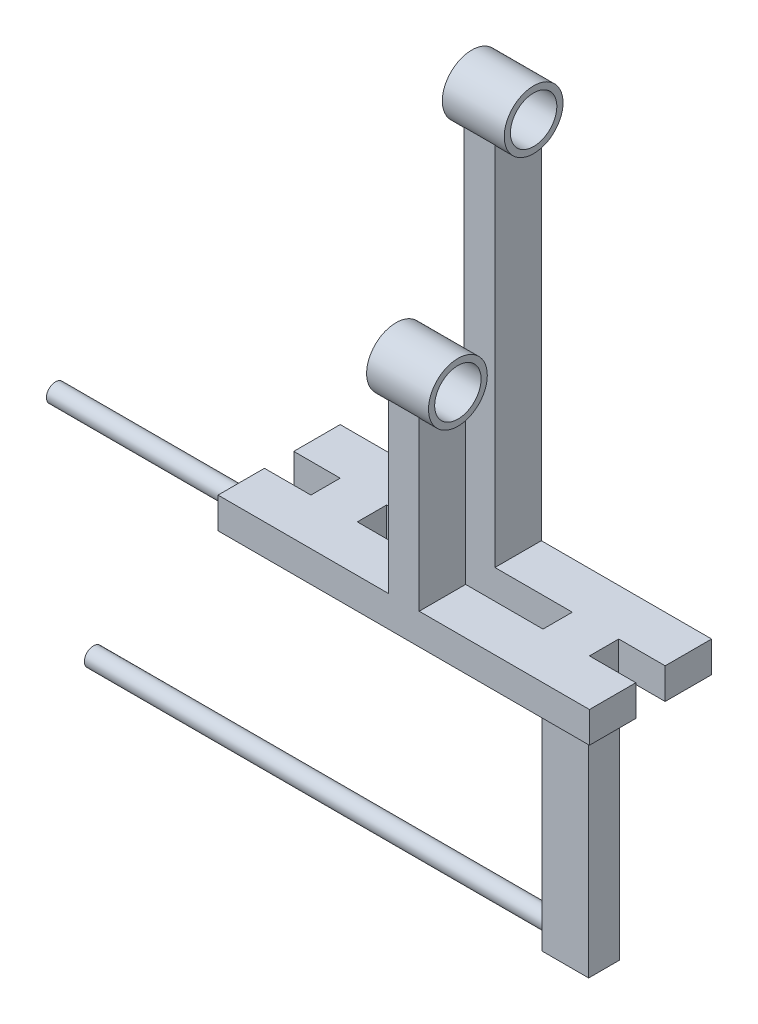
ISO-10303-21;
HEADER;
FILE_DESCRIPTION(('STEP AP214'),'2;1');
FILE_NAME('part.step','',(''),(''),'','','');
FILE_SCHEMA(('AUTOMOTIVE_DESIGN { 1 0 10303 214 1 1 1 1 }'));
ENDSEC;
DATA;
#1=APPLICATION_CONTEXT('core data for automotive mechanical design processes');
#2=APPLICATION_PROTOCOL_DEFINITION('international standard','automotive_design',2000,#1);
#3=PRODUCT_CONTEXT('',#1,'mechanical');
#4=PRODUCT('Part','Part','',(#3));
#5=PRODUCT_RELATED_PRODUCT_CATEGORY('part','',(#4));
#6=PRODUCT_DEFINITION_FORMATION('','',#4);
#7=PRODUCT_DEFINITION_CONTEXT('part definition',#1,'design');
#8=PRODUCT_DEFINITION('design','',#6,#7);
#9=PRODUCT_DEFINITION_SHAPE('','',#8);
#10=(LENGTH_UNIT() NAMED_UNIT(*) SI_UNIT(.MILLI.,.METRE.));
#11=(NAMED_UNIT(*) PLANE_ANGLE_UNIT() SI_UNIT($,.RADIAN.));
#12=(NAMED_UNIT(*) SI_UNIT($,.STERADIAN.) SOLID_ANGLE_UNIT());
#13=UNCERTAINTY_MEASURE_WITH_UNIT(LENGTH_MEASURE(1.E-05),#10,'distance_accuracy_value','');
#14=(GEOMETRIC_REPRESENTATION_CONTEXT(3) GLOBAL_UNCERTAINTY_ASSIGNED_CONTEXT((#13)) GLOBAL_UNIT_ASSIGNED_CONTEXT((#10,
#11,#12)) REPRESENTATION_CONTEXT('',''));
#15=CARTESIAN_POINT('',(0.,0.,0.));
#16=DIRECTION('',(0.,0.,1.));
#17=DIRECTION('',(1.,0.,0.));
#18=AXIS2_PLACEMENT_3D('',#15,#16,#17);
#19=CARTESIAN_POINT('',(-60.,10.,-24.4666089));
#20=DIRECTION('',(0.,0.,1.));
#21=DIRECTION('',(1.,0.,0.));
#22=AXIS2_PLACEMENT_3D('',#19,#20,#21);
#23=PLANE('',#22);
#24=DIRECTION('',(-1.,0.,0.));
#25=VECTOR('',#24,1.);
#26=CARTESIAN_POINT('',(10.,128.219307305155,-24.4666089));
#27=LINE('',#26,#25);
#28=CARTESIAN_POINT('',(5.00000000000001,128.219307305155,-24.4666089));
#29=VERTEX_POINT('',#28);
#30=CARTESIAN_POINT('',(-5.,128.219307305155,-24.4666089));
#31=VERTEX_POINT('',#30);
#32=EDGE_CURVE('E289',#29,#31,#27,.T.);
#33=ORIENTED_EDGE('',*,*,#32,.F.);
#34=DIRECTION('',(0.,-1.,0.));
#35=VECTOR('',#34,1.);
#36=CARTESIAN_POINT('',(5.00000000000001,70.,-24.4666089));
#37=LINE('',#36,#35);
#38=CARTESIAN_POINT('',(5.00000000000001,10.,-24.4666089));
#39=VERTEX_POINT('',#38);
#40=EDGE_CURVE('E336',#29,#39,#37,.T.);
#41=ORIENTED_EDGE('',*,*,#40,.T.);
#42=DIRECTION('',(-1.,0.,0.));
#43=VECTOR('',#42,1.);
#44=CARTESIAN_POINT('',(-60.,10.,-24.4666089));
#45=LINE('',#44,#43);
#46=CARTESIAN_POINT('',(60.,10.,-24.4666089));
#47=VERTEX_POINT('',#46);
#48=EDGE_CURVE('E426',#47,#39,#45,.T.);
#49=ORIENTED_EDGE('',*,*,#48,.F.);
#50=DIRECTION('',(0.,-1.,0.));
#51=VECTOR('',#50,1.);
#52=CARTESIAN_POINT('',(60.,10.,-24.4666089));
#53=LINE('',#52,#51);
#54=CARTESIAN_POINT('',(60.,0.,-24.4666089));
#55=VERTEX_POINT('',#54);
#56=EDGE_CURVE('E511',#47,#55,#53,.T.);
#57=ORIENTED_EDGE('',*,*,#56,.T.);
#58=DIRECTION('',(-1.,0.,0.));
#59=VECTOR('',#58,1.);
#60=CARTESIAN_POINT('',(-60.,0.,-24.4666089));
#61=LINE('',#60,#59);
#62=CARTESIAN_POINT('',(-60.,0.,-24.4666089));
#63=VERTEX_POINT('',#62);
#64=EDGE_CURVE('E464',#55,#63,#61,.T.);
#65=ORIENTED_EDGE('',*,*,#64,.T.);
#66=DIRECTION('',(0.,-1.,0.));
#67=VECTOR('',#66,1.);
#68=CARTESIAN_POINT('',(-60.,10.,-24.4666089));
#69=LINE('',#68,#67);
#70=CARTESIAN_POINT('',(-60.,10.,-24.4666089));
#71=VERTEX_POINT('',#70);
#72=EDGE_CURVE('E507',#71,#63,#69,.T.);
#73=ORIENTED_EDGE('',*,*,#72,.F.);
#74=CARTESIAN_POINT('',(-5.,10.,-24.4666089));
#75=VERTEX_POINT('',#74);
#76=EDGE_CURVE('E425',#75,#71,#45,.T.);
#77=ORIENTED_EDGE('',*,*,#76,.F.);
#78=DIRECTION('',(0.,-1.,0.));
#79=VECTOR('',#78,1.);
#80=CARTESIAN_POINT('',(-5.,70.,-24.4666089));
#81=LINE('',#80,#79);
#82=EDGE_CURVE('E333',#31,#75,#81,.T.);
#83=ORIENTED_EDGE('',*,*,#82,.F.);
#84=EDGE_LOOP('',(#33,#41,#49,#57,#65,#73,#77,#83));
#85=FACE_BOUND('',#84,.T.);
#86=ADVANCED_FACE('F51',(#85),#23,.F.);
#87=CARTESIAN_POINT('',(-30.,10.,-9.46660889999996));
#88=DIRECTION('',(0.,0.,1.));
#89=DIRECTION('',(1.,0.,0.));
#90=AXIS2_PLACEMENT_3D('',#87,#88,#89);
#91=PLANE('',#90);
#92=DIRECTION('',(0.,-1.,0.));
#93=VECTOR('',#92,1.);
#94=CARTESIAN_POINT('',(5.00000000000001,70.,-9.46660889999996));
#95=LINE('',#94,#93);
#96=CARTESIAN_POINT('',(5.00000000000001,128.219307305155,-9.46660889999996));
#97=VERTEX_POINT('',#96);
#98=CARTESIAN_POINT('',(5.00000000000001,10.,-9.46660889999996));
#99=VERTEX_POINT('',#98);
#100=EDGE_CURVE('E339',#97,#99,#95,.T.);
#101=ORIENTED_EDGE('',*,*,#100,.F.);
#102=DIRECTION('',(-1.,0.,0.));
#103=VECTOR('',#102,1.);
#104=CARTESIAN_POINT('',(10.,128.219307305155,-9.46660889999996));
#105=LINE('',#104,#103);
#106=CARTESIAN_POINT('',(-5.,128.219307305155,-9.46660889999996));
#107=VERTEX_POINT('',#106);
#108=EDGE_CURVE('E283',#97,#107,#105,.T.);
#109=ORIENTED_EDGE('',*,*,#108,.T.);
#110=DIRECTION('',(0.,-1.,0.));
#111=VECTOR('',#110,1.);
#112=CARTESIAN_POINT('',(-5.,70.,-9.46660889999996));
#113=LINE('',#112,#111);
#114=CARTESIAN_POINT('',(-5.,10.,-9.46660889999996));
#115=VERTEX_POINT('',#114);
#116=EDGE_CURVE('E342',#107,#115,#113,.T.);
#117=ORIENTED_EDGE('',*,*,#116,.T.);
#118=DIRECTION('',(-1.,0.,0.));
#119=VECTOR('',#118,1.);
#120=CARTESIAN_POINT('',(-30.,10.,-9.46660889999996));
#121=LINE('',#120,#119);
#122=CARTESIAN_POINT('',(-30.,10.,-9.46660889999996));
#123=VERTEX_POINT('',#122);
#124=EDGE_CURVE('E379',#115,#123,#121,.T.);
#125=ORIENTED_EDGE('',*,*,#124,.T.);
#126=DIRECTION('',(0.,-1.,0.));
#127=VECTOR('',#126,1.);
#128=CARTESIAN_POINT('',(-30.,10.,-9.46660889999996));
#129=LINE('',#128,#127);
#130=CARTESIAN_POINT('',(-30.,0.,-9.46660889999996));
#131=VERTEX_POINT('',#130);
#132=EDGE_CURVE('E384',#123,#131,#129,.T.);
#133=ORIENTED_EDGE('',*,*,#132,.T.);
#134=DIRECTION('',(-1.,0.,0.));
#135=VECTOR('',#134,1.);
#136=CARTESIAN_POINT('',(-30.,0.,-9.46660889999996));
#137=LINE('',#136,#135);
#138=CARTESIAN_POINT('',(30.,0.,-9.46660889999996));
#139=VERTEX_POINT('',#138);
#140=EDGE_CURVE('E370',#139,#131,#137,.T.);
#141=ORIENTED_EDGE('',*,*,#140,.F.);
#142=DIRECTION('',(0.,-1.,0.));
#143=VECTOR('',#142,1.);
#144=CARTESIAN_POINT('',(30.,10.,-9.46660889999996));
#145=LINE('',#144,#143);
#146=CARTESIAN_POINT('',(30.,10.,-9.46660889999996));
#147=VERTEX_POINT('',#146);
#148=EDGE_CURVE('E397',#147,#139,#145,.T.);
#149=ORIENTED_EDGE('',*,*,#148,.F.);
#150=EDGE_CURVE('E380',#147,#99,#121,.T.);
#151=ORIENTED_EDGE('',*,*,#150,.T.);
#152=EDGE_LOOP('',(#101,#109,#117,#125,#133,#141,#149,#151));
#153=FACE_BOUND('',#152,.T.);
#154=ADVANCED_FACE('F644',(#153),#91,.T.);
#155=CARTESIAN_POINT('',(60.,10.,15.));
#156=DIRECTION('',(0.,0.,-1.));
#157=DIRECTION('',(-1.,0.,0.));
#158=AXIS2_PLACEMENT_3D('',#155,#156,#157);
#159=PLANE('',#158);
#160=DIRECTION('',(-1.,0.,0.));
#161=VECTOR('',#160,1.);
#162=CARTESIAN_POINT('',(10.,64.1690481051547,15.));
#163=LINE('',#162,#161);
#164=CARTESIAN_POINT('',(-5.,64.1690481051547,15.));
#165=VERTEX_POINT('',#164);
#166=CARTESIAN_POINT('',(5.,64.1690481051547,15.));
#167=VERTEX_POINT('',#166);
#168=EDGE_CURVE('E317',#165,#167,#163,.F.);
#169=ORIENTED_EDGE('',*,*,#168,.F.);
#170=DIRECTION('',(0.,-1.,0.));
#171=VECTOR('',#170,1.);
#172=CARTESIAN_POINT('',(-5.,70.,15.));
#173=LINE('',#172,#171);
#174=CARTESIAN_POINT('',(-5.,10.,15.));
#175=VERTEX_POINT('',#174);
#176=EDGE_CURVE('E362',#165,#175,#173,.T.);
#177=ORIENTED_EDGE('',*,*,#176,.T.);
#178=DIRECTION('',(1.,0.,0.));
#179=VECTOR('',#178,1.);
#180=CARTESIAN_POINT('',(60.,10.,15.));
#181=LINE('',#180,#179);
#182=CARTESIAN_POINT('',(-60.,10.,15.));
#183=VERTEX_POINT('',#182);
#184=EDGE_CURVE('E446',#183,#175,#181,.T.);
#185=ORIENTED_EDGE('',*,*,#184,.F.);
#186=DIRECTION('',(0.,-1.,0.));
#187=VECTOR('',#186,1.);
#188=CARTESIAN_POINT('',(-60.,10.,15.));
#189=LINE('',#188,#187);
#190=CARTESIAN_POINT('',(-60.,0.,15.));
#191=VERTEX_POINT('',#190);
#192=EDGE_CURVE('E487',#183,#191,#189,.T.);
#193=ORIENTED_EDGE('',*,*,#192,.T.);
#194=DIRECTION('',(1.,0.,0.));
#195=VECTOR('',#194,1.);
#196=CARTESIAN_POINT('',(60.,0.,15.));
#197=LINE('',#196,#195);
#198=CARTESIAN_POINT('',(60.,0.,15.));
#199=VERTEX_POINT('',#198);
#200=EDGE_CURVE('E413',#191,#199,#197,.T.);
#201=ORIENTED_EDGE('',*,*,#200,.T.);
#202=DIRECTION('',(0.,-1.,0.));
#203=VECTOR('',#202,1.);
#204=CARTESIAN_POINT('',(60.,10.,15.));
#205=LINE('',#204,#203);
#206=CARTESIAN_POINT('',(60.,10.,15.));
#207=VERTEX_POINT('',#206);
#208=EDGE_CURVE('E450',#207,#199,#205,.T.);
#209=ORIENTED_EDGE('',*,*,#208,.F.);
#210=CARTESIAN_POINT('',(5.,10.,15.));
#211=VERTEX_POINT('',#210);
#212=EDGE_CURVE('E445',#211,#207,#181,.T.);
#213=ORIENTED_EDGE('',*,*,#212,.F.);
#214=DIRECTION('',(0.,-1.,0.));
#215=VECTOR('',#214,1.);
#216=CARTESIAN_POINT('',(5.,70.,15.));
#217=LINE('',#216,#215);
#218=EDGE_CURVE('E359',#167,#211,#217,.T.);
#219=ORIENTED_EDGE('',*,*,#218,.F.);
#220=EDGE_LOOP('',(#169,#177,#185,#193,#201,#209,#213,#219));
#221=FACE_BOUND('',#220,.T.);
#222=ADVANCED_FACE('F606',(#221),#159,.F.);
#223=CARTESIAN_POINT('',(-30.,10.,0.));
#224=DIRECTION('',(0.,0.,-1.));
#225=DIRECTION('',(-1.,0.,0.));
#226=AXIS2_PLACEMENT_3D('',#223,#224,#225);
#227=PLANE('',#226);
#228=DIRECTION('',(0.,-1.,0.));
#229=VECTOR('',#228,1.);
#230=CARTESIAN_POINT('',(-5.,70.,0.));
#231=LINE('',#230,#229);
#232=CARTESIAN_POINT('',(-5.,64.1690481051547,0.));
#233=VERTEX_POINT('',#232);
#234=CARTESIAN_POINT('',(-5.,10.,0.));
#235=VERTEX_POINT('',#234);
#236=EDGE_CURVE('E353',#233,#235,#231,.T.);
#237=ORIENTED_EDGE('',*,*,#236,.F.);
#238=DIRECTION('',(-1.,0.,0.));
#239=VECTOR('',#238,1.);
#240=CARTESIAN_POINT('',(10.,64.1690481051547,0.));
#241=LINE('',#240,#239);
#242=CARTESIAN_POINT('',(5.00000000000001,64.1690481051547,0.));
#243=VERTEX_POINT('',#242);
#244=EDGE_CURVE('E310',#233,#243,#241,.F.);
#245=ORIENTED_EDGE('',*,*,#244,.T.);
#246=DIRECTION('',(0.,-1.,0.));
#247=VECTOR('',#246,1.);
#248=CARTESIAN_POINT('',(5.00000000000001,70.,0.));
#249=LINE('',#248,#247);
#250=CARTESIAN_POINT('',(5.00000000000001,10.,0.));
#251=VERTEX_POINT('',#250);
#252=EDGE_CURVE('E356',#243,#251,#249,.T.);
#253=ORIENTED_EDGE('',*,*,#252,.T.);
#254=DIRECTION('',(1.,0.,0.));
#255=VECTOR('',#254,1.);
#256=CARTESIAN_POINT('',(-30.,10.,0.));
#257=LINE('',#256,#255);
#258=CARTESIAN_POINT('',(30.,10.,0.));
#259=VERTEX_POINT('',#258);
#260=EDGE_CURVE('E369',#251,#259,#257,.T.);
#261=ORIENTED_EDGE('',*,*,#260,.T.);
#262=DIRECTION('',(0.,-1.,0.));
#263=VECTOR('',#262,1.);
#264=CARTESIAN_POINT('',(30.,10.,0.));
#265=LINE('',#264,#263);
#266=CARTESIAN_POINT('',(30.,0.,0.));
#267=VERTEX_POINT('',#266);
#268=EDGE_CURVE('E400',#259,#267,#265,.T.);
#269=ORIENTED_EDGE('',*,*,#268,.T.);
#270=DIRECTION('',(1.,0.,0.));
#271=VECTOR('',#270,1.);
#272=CARTESIAN_POINT('',(-30.,0.,0.));
#273=LINE('',#272,#271);
#274=CARTESIAN_POINT('',(-30.,0.,0.));
#275=VERTEX_POINT('',#274);
#276=EDGE_CURVE('E388',#275,#267,#273,.T.);
#277=ORIENTED_EDGE('',*,*,#276,.F.);
#278=DIRECTION('',(0.,-1.,0.));
#279=VECTOR('',#278,1.);
#280=CARTESIAN_POINT('',(-30.,10.,0.));
#281=LINE('',#280,#279);
#282=CARTESIAN_POINT('',(-30.,10.,0.));
#283=VERTEX_POINT('',#282);
#284=EDGE_CURVE('E403',#283,#275,#281,.T.);
#285=ORIENTED_EDGE('',*,*,#284,.F.);
#286=EDGE_CURVE('E371',#283,#235,#257,.T.);
#287=ORIENTED_EDGE('',*,*,#286,.T.);
#288=EDGE_LOOP('',(#237,#245,#253,#261,#269,#277,#285,#287));
#289=FACE_BOUND('',#288,.T.);
#290=ADVANCED_FACE('F660',(#289),#227,.T.);
#291=CARTESIAN_POINT('',(0.,10.,0.));
#292=DIRECTION('',(0.,-1.,0.));
#293=DIRECTION('',(0.,0.,-1.));
#294=AXIS2_PLACEMENT_3D('',#291,#292,#293);
#295=PLANE('',#294);
#296=DIRECTION('',(0.,0.,1.));
#297=VECTOR('',#296,1.);
#298=CARTESIAN_POINT('',(-5.,10.,-24.4666089));
#299=LINE('',#298,#297);
#300=EDGE_CURVE('E325',#75,#115,#299,.T.);
#301=ORIENTED_EDGE('',*,*,#300,.F.);
#302=ORIENTED_EDGE('',*,*,#76,.T.);
#303=DIRECTION('',(0.,0.,1.));
#304=VECTOR('',#303,1.);
#305=CARTESIAN_POINT('',(-60.,10.,-9.46660889999996));
#306=LINE('',#305,#304);
#307=CARTESIAN_POINT('',(-60.,10.,-9.46660889999996));
#308=VERTEX_POINT('',#307);
#309=EDGE_CURVE('E430',#71,#308,#306,.T.);
#310=ORIENTED_EDGE('',*,*,#309,.T.);
#311=DIRECTION('',(1.,0.,0.));
#312=VECTOR('',#311,1.);
#313=CARTESIAN_POINT('',(-45.,10.,-9.46660889999996));
#314=LINE('',#313,#312);
#315=CARTESIAN_POINT('',(-45.,10.,-9.46660889999996));
#316=VERTEX_POINT('',#315);
#317=EDGE_CURVE('E433',#308,#316,#314,.T.);
#318=ORIENTED_EDGE('',*,*,#317,.T.);
#319=DIRECTION('',(0.,0.,1.));
#320=VECTOR('',#319,1.);
#321=CARTESIAN_POINT('',(-45.,10.,0.));
#322=LINE('',#321,#320);
#323=CARTESIAN_POINT('',(-45.,10.,0.));
#324=VERTEX_POINT('',#323);
#325=EDGE_CURVE('E436',#316,#324,#322,.T.);
#326=ORIENTED_EDGE('',*,*,#325,.T.);
#327=DIRECTION('',(-1.,0.,0.));
#328=VECTOR('',#327,1.);
#329=CARTESIAN_POINT('',(-60.,10.,0.));
#330=LINE('',#329,#328);
#331=CARTESIAN_POINT('',(-60.,10.,0.));
#332=VERTEX_POINT('',#331);
#333=EDGE_CURVE('E439',#324,#332,#330,.T.);
#334=ORIENTED_EDGE('',*,*,#333,.T.);
#335=DIRECTION('',(0.,0.,1.));
#336=VECTOR('',#335,1.);
#337=CARTESIAN_POINT('',(-60.,10.,15.));
#338=LINE('',#337,#336);
#339=EDGE_CURVE('E442',#332,#183,#338,.T.);
#340=ORIENTED_EDGE('',*,*,#339,.T.);
#341=ORIENTED_EDGE('',*,*,#184,.T.);
#342=DIRECTION('',(0.,0.,1.));
#343=VECTOR('',#342,1.);
#344=CARTESIAN_POINT('',(-5.,10.,0.));
#345=LINE('',#344,#343);
#346=EDGE_CURVE('E345',#235,#175,#345,.T.);
#347=ORIENTED_EDGE('',*,*,#346,.F.);
#348=ORIENTED_EDGE('',*,*,#286,.F.);
#349=DIRECTION('',(0.,0.,1.));
#350=VECTOR('',#349,1.);
#351=CARTESIAN_POINT('',(-30.,10.,0.));
#352=LINE('',#351,#350);
#353=EDGE_CURVE('E366',#123,#283,#352,.T.);
#354=ORIENTED_EDGE('',*,*,#353,.F.);
#355=ORIENTED_EDGE('',*,*,#124,.F.);
#356=EDGE_LOOP('',(#301,#302,#310,#318,#326,#334,#340,#341,#347,#348,#354,#355));
#357=FACE_BOUND('',#356,.T.);
#358=ADVANCED_FACE('F666',(#357),#295,.F.);
#359=DIRECTION('',(0.,0.,-1.));
#360=VECTOR('',#359,1.);
#361=CARTESIAN_POINT('',(5.00000000000001,10.,-24.4666089));
#362=LINE('',#361,#360);
#363=EDGE_CURVE('E329',#99,#39,#362,.T.);
#364=ORIENTED_EDGE('',*,*,#363,.F.);
#365=ORIENTED_EDGE('',*,*,#150,.F.);
#366=DIRECTION('',(0.,0.,-1.));
#367=VECTOR('',#366,1.);
#368=CARTESIAN_POINT('',(30.,10.,0.));
#369=LINE('',#368,#367);
#370=EDGE_CURVE('E375',#259,#147,#369,.T.);
#371=ORIENTED_EDGE('',*,*,#370,.F.);
#372=ORIENTED_EDGE('',*,*,#260,.F.);
#373=DIRECTION('',(0.,0.,-1.));
#374=VECTOR('',#373,1.);
#375=CARTESIAN_POINT('',(5.00000000000001,10.,0.));
#376=LINE('',#375,#374);
#377=EDGE_CURVE('E349',#211,#251,#376,.T.);
#378=ORIENTED_EDGE('',*,*,#377,.F.);
#379=ORIENTED_EDGE('',*,*,#212,.T.);
#380=DIRECTION('',(0.,0.,-1.));
#381=VECTOR('',#380,1.);
#382=CARTESIAN_POINT('',(60.,10.,0.));
#383=LINE('',#382,#381);
#384=CARTESIAN_POINT('',(60.,10.,0.));
#385=VERTEX_POINT('',#384);
#386=EDGE_CURVE('E408',#207,#385,#383,.T.);
#387=ORIENTED_EDGE('',*,*,#386,.T.);
#388=DIRECTION('',(-1.,0.,0.));
#389=VECTOR('',#388,1.);
#390=CARTESIAN_POINT('',(45.,10.,0.));
#391=LINE('',#390,#389);
#392=CARTESIAN_POINT('',(45.,10.,0.));
#393=VERTEX_POINT('',#392);
#394=EDGE_CURVE('E412',#385,#393,#391,.T.);
#395=ORIENTED_EDGE('',*,*,#394,.T.);
#396=DIRECTION('',(0.,0.,-1.));
#397=VECTOR('',#396,1.);
#398=CARTESIAN_POINT('',(45.,10.,-9.46660889999997));
#399=LINE('',#398,#397);
#400=CARTESIAN_POINT('',(45.,10.,-9.46660889999997));
#401=VERTEX_POINT('',#400);
#402=EDGE_CURVE('E416',#393,#401,#399,.T.);
#403=ORIENTED_EDGE('',*,*,#402,.T.);
#404=DIRECTION('',(1.,0.,0.));
#405=VECTOR('',#404,1.);
#406=CARTESIAN_POINT('',(60.,10.,-9.46660889999997));
#407=LINE('',#406,#405);
#408=CARTESIAN_POINT('',(60.,10.,-9.46660889999997));
#409=VERTEX_POINT('',#408);
#410=EDGE_CURVE('E419',#401,#409,#407,.T.);
#411=ORIENTED_EDGE('',*,*,#410,.T.);
#412=DIRECTION('',(0.,0.,-1.));
#413=VECTOR('',#412,1.);
#414=CARTESIAN_POINT('',(60.,10.,-24.4666089));
#415=LINE('',#414,#413);
#416=EDGE_CURVE('E422',#409,#47,#415,.T.);
#417=ORIENTED_EDGE('',*,*,#416,.T.);
#418=ORIENTED_EDGE('',*,*,#48,.T.);
#419=EDGE_LOOP('',(#364,#365,#371,#372,#378,#379,#387,#395,#403,#411,#417,#418));
#420=FACE_BOUND('',#419,.T.);
#421=ADVANCED_FACE('F592',(#420),#295,.F.);
#422=CARTESIAN_POINT('',(0.,0.,0.));
#423=DIRECTION('',(0.,-1.,0.));
#424=DIRECTION('',(0.,0.,-1.));
#425=AXIS2_PLACEMENT_3D('',#422,#423,#424);
#426=PLANE('',#425);
#427=DIRECTION('',(0.,0.,-1.));
#428=VECTOR('',#427,1.);
#429=CARTESIAN_POINT('',(30.,0.,-9.74999999999998));
#430=LINE('',#429,#428);
#431=CARTESIAN_POINT('',(30.,0.,0.250000000000016));
#432=VERTEX_POINT('',#431);
#433=EDGE_CURVE('E67',#432,#267,#430,.T.);
#434=ORIENTED_EDGE('',*,*,#433,.F.);
#435=DIRECTION('',(-1.,0.,0.));
#436=VECTOR('',#435,1.);
#437=CARTESIAN_POINT('',(30.,0.,0.250000000000016));
#438=LINE('',#437,#436);
#439=CARTESIAN_POINT('',(45.,0.,0.250000000000016));
#440=VERTEX_POINT('',#439);
#441=EDGE_CURVE('E71',#440,#432,#438,.T.);
#442=ORIENTED_EDGE('',*,*,#441,.F.);
#443=DIRECTION('',(0.,0.,1.));
#444=VECTOR('',#443,1.);
#445=CARTESIAN_POINT('',(45.,0.,-9.74999999999998));
#446=LINE('',#445,#444);
#447=CARTESIAN_POINT('',(45.,0.,0.));
#448=VERTEX_POINT('',#447);
#449=EDGE_CURVE('E60',#448,#440,#446,.T.);
#450=ORIENTED_EDGE('',*,*,#449,.F.);
#451=DIRECTION('',(-1.,0.,0.));
#452=VECTOR('',#451,1.);
#453=CARTESIAN_POINT('',(45.,0.,0.));
#454=LINE('',#453,#452);
#455=CARTESIAN_POINT('',(60.,0.,0.));
#456=VERTEX_POINT('',#455);
#457=EDGE_CURVE('E454',#456,#448,#454,.T.);
#458=ORIENTED_EDGE('',*,*,#457,.F.);
#459=DIRECTION('',(0.,0.,-1.));
#460=VECTOR('',#459,1.);
#461=CARTESIAN_POINT('',(60.,0.,0.));
#462=LINE('',#461,#460);
#463=EDGE_CURVE('E407',#199,#456,#462,.T.);
#464=ORIENTED_EDGE('',*,*,#463,.F.);
#465=ORIENTED_EDGE('',*,*,#200,.F.);
#466=DIRECTION('',(0.,0.,1.));
#467=VECTOR('',#466,1.);
#468=CARTESIAN_POINT('',(-60.,0.,15.));
#469=LINE('',#468,#467);
#470=CARTESIAN_POINT('',(-60.,0.,0.));
#471=VERTEX_POINT('',#470);
#472=EDGE_CURVE('E479',#471,#191,#469,.T.);
#473=ORIENTED_EDGE('',*,*,#472,.F.);
#474=DIRECTION('',(-1.,0.,0.));
#475=VECTOR('',#474,1.);
#476=CARTESIAN_POINT('',(-60.,0.,0.));
#477=LINE('',#476,#475);
#478=CARTESIAN_POINT('',(-45.,0.,0.));
#479=VERTEX_POINT('',#478);
#480=EDGE_CURVE('E476',#479,#471,#477,.T.);
#481=ORIENTED_EDGE('',*,*,#480,.F.);
#482=DIRECTION('',(0.,0.,1.));
#483=VECTOR('',#482,1.);
#484=CARTESIAN_POINT('',(-45.,0.,0.));
#485=LINE('',#484,#483);
#486=CARTESIAN_POINT('',(-45.,0.,-9.46660889999996));
#487=VERTEX_POINT('',#486);
#488=EDGE_CURVE('E473',#487,#479,#485,.T.);
#489=ORIENTED_EDGE('',*,*,#488,.F.);
#490=DIRECTION('',(1.,0.,0.));
#491=VECTOR('',#490,1.);
#492=CARTESIAN_POINT('',(-45.,0.,-9.46660889999996));
#493=LINE('',#492,#491);
#494=CARTESIAN_POINT('',(-60.,0.,-9.46660889999996));
#495=VERTEX_POINT('',#494);
#496=EDGE_CURVE('E470',#495,#487,#493,.T.);
#497=ORIENTED_EDGE('',*,*,#496,.F.);
#498=DIRECTION('',(0.,0.,1.));
#499=VECTOR('',#498,1.);
#500=CARTESIAN_POINT('',(-60.,0.,-9.46660889999996));
#501=LINE('',#500,#499);
#502=EDGE_CURVE('E467',#63,#495,#501,.T.);
#503=ORIENTED_EDGE('',*,*,#502,.F.);
#504=ORIENTED_EDGE('',*,*,#64,.F.);
#505=DIRECTION('',(0.,0.,-1.));
#506=VECTOR('',#505,1.);
#507=CARTESIAN_POINT('',(60.,0.,-24.4666089));
#508=LINE('',#507,#506);
#509=CARTESIAN_POINT('',(60.,0.,-9.46660889999997));
#510=VERTEX_POINT('',#509);
#511=EDGE_CURVE('E461',#510,#55,#508,.T.);
#512=ORIENTED_EDGE('',*,*,#511,.F.);
#513=DIRECTION('',(1.,0.,0.));
#514=VECTOR('',#513,1.);
#515=CARTESIAN_POINT('',(60.,0.,-9.46660889999997));
#516=LINE('',#515,#514);
#517=CARTESIAN_POINT('',(45.,0.,-9.46660889999997));
#518=VERTEX_POINT('',#517);
#519=EDGE_CURVE('E458',#518,#510,#516,.T.);
#520=ORIENTED_EDGE('',*,*,#519,.F.);
#521=CARTESIAN_POINT('',(45.,0.,-9.74999999999998));
#522=VERTEX_POINT('',#521);
#523=EDGE_CURVE('E542',#522,#518,#446,.T.);
#524=ORIENTED_EDGE('',*,*,#523,.F.);
#525=DIRECTION('',(1.,0.,0.));
#526=VECTOR('',#525,1.);
#527=CARTESIAN_POINT('',(30.,0.,-9.74999999999998));
#528=LINE('',#527,#526);
#529=CARTESIAN_POINT('',(30.,0.,-9.74999999999998));
#530=VERTEX_POINT('',#529);
#531=EDGE_CURVE('E546',#530,#522,#528,.T.);
#532=ORIENTED_EDGE('',*,*,#531,.F.);
#533=EDGE_CURVE('E262',#139,#530,#430,.T.);
#534=ORIENTED_EDGE('',*,*,#533,.F.);
#535=ORIENTED_EDGE('',*,*,#140,.T.);
#536=DIRECTION('',(0.,0.,1.));
#537=VECTOR('',#536,1.);
#538=CARTESIAN_POINT('',(-30.,0.,0.));
#539=LINE('',#538,#537);
#540=EDGE_CURVE('E365',#131,#275,#539,.T.);
#541=ORIENTED_EDGE('',*,*,#540,.T.);
#542=ORIENTED_EDGE('',*,*,#276,.T.);
#543=EDGE_LOOP('',(#434,#442,#450,#458,#464,#465,#473,#481,#489,#497,#503,#504,#512,#520,#524,
#532,#534,#535,#541,#542));
#544=FACE_BOUND('',#543,.T.);
#545=ADVANCED_FACE('F579',(#544),#426,.T.);
#546=CARTESIAN_POINT('',(60.,10.,0.));
#547=DIRECTION('',(-1.,0.,0.));
#548=DIRECTION('',(0.,0.,1.));
#549=AXIS2_PLACEMENT_3D('',#546,#547,#548);
#550=PLANE('',#549);
#551=ORIENTED_EDGE('',*,*,#463,.T.);
#552=DIRECTION('',(0.,-1.,0.));
#553=VECTOR('',#552,1.);
#554=CARTESIAN_POINT('',(60.,10.,0.));
#555=LINE('',#554,#553);
#556=EDGE_CURVE('E526',#385,#456,#555,.T.);
#557=ORIENTED_EDGE('',*,*,#556,.F.);
#558=ORIENTED_EDGE('',*,*,#386,.F.);
#559=ORIENTED_EDGE('',*,*,#208,.T.);
#560=EDGE_LOOP('',(#551,#557,#558,#559));
#561=FACE_BOUND('',#560,.T.);
#562=ADVANCED_FACE('F53',(#561),#550,.F.);
#563=CARTESIAN_POINT('',(45.,10.,0.));
#564=DIRECTION('',(0.,0.,1.));
#565=DIRECTION('',(1.,0.,0.));
#566=AXIS2_PLACEMENT_3D('',#563,#564,#565);
#567=PLANE('',#566);
#568=ORIENTED_EDGE('',*,*,#457,.T.);
#569=DIRECTION('',(0.,-1.,0.));
#570=VECTOR('',#569,1.);
#571=CARTESIAN_POINT('',(45.,10.,0.));
#572=LINE('',#571,#570);
#573=EDGE_CURVE('E522',#393,#448,#572,.T.);
#574=ORIENTED_EDGE('',*,*,#573,.F.);
#575=ORIENTED_EDGE('',*,*,#394,.F.);
#576=ORIENTED_EDGE('',*,*,#556,.T.);
#577=EDGE_LOOP('',(#568,#574,#575,#576));
#578=FACE_BOUND('',#577,.T.);
#579=ADVANCED_FACE('F596',(#578),#567,.F.);
#580=CARTESIAN_POINT('',(45.,10.,-9.46660889999997));
#581=DIRECTION('',(-1.,0.,0.));
#582=DIRECTION('',(0.,0.,1.));
#583=AXIS2_PLACEMENT_3D('',#580,#581,#582);
#584=PLANE('',#583);
#585=ORIENTED_EDGE('',*,*,#573,.T.);
#586=ORIENTED_EDGE('',*,*,#449,.T.);
#587=DIRECTION('',(0.,1.,0.));
#588=VECTOR('',#587,1.);
#589=CARTESIAN_POINT('',(45.,-80.,0.250000000000016));
#590=LINE('',#589,#588);
#591=CARTESIAN_POINT('',(45.,-80.,0.250000000000016));
#592=VERTEX_POINT('',#591);
#593=EDGE_CURVE('E271',#592,#440,#590,.T.);
#594=ORIENTED_EDGE('',*,*,#593,.F.);
#595=DIRECTION('',(0.,0.,1.));
#596=VECTOR('',#595,1.);
#597=CARTESIAN_POINT('',(45.,-80.,-9.74999999999998));
#598=LINE('',#597,#596);
#599=CARTESIAN_POINT('',(45.,-80.,-9.74999999999998));
#600=VERTEX_POINT('',#599);
#601=EDGE_CURVE('E247',#600,#592,#598,.T.);
#602=ORIENTED_EDGE('',*,*,#601,.F.);
#603=DIRECTION('',(0.,1.,0.));
#604=VECTOR('',#603,1.);
#605=CARTESIAN_POINT('',(45.,-80.,-9.74999999999998));
#606=LINE('',#605,#604);
#607=EDGE_CURVE('E243',#600,#522,#606,.T.);
#608=ORIENTED_EDGE('',*,*,#607,.T.);
#609=ORIENTED_EDGE('',*,*,#523,.T.);
#610=DIRECTION('',(0.,-1.,0.));
#611=VECTOR('',#610,1.);
#612=CARTESIAN_POINT('',(45.,10.,-9.46660889999997));
#613=LINE('',#612,#611);
#614=EDGE_CURVE('E519',#401,#518,#613,.T.);
#615=ORIENTED_EDGE('',*,*,#614,.F.);
#616=ORIENTED_EDGE('',*,*,#402,.F.);
#617=EDGE_LOOP('',(#585,#586,#594,#602,#608,#609,#615,#616));
#618=FACE_BOUND('',#617,.T.);
#619=ADVANCED_FACE('F575',(#618),#584,.F.);
#620=CARTESIAN_POINT('',(60.,10.,-9.46660889999997));
#621=DIRECTION('',(0.,0.,-1.));
#622=DIRECTION('',(-1.,0.,0.));
#623=AXIS2_PLACEMENT_3D('',#620,#621,#622);
#624=PLANE('',#623);
#625=ORIENTED_EDGE('',*,*,#519,.T.);
#626=DIRECTION('',(0.,-1.,0.));
#627=VECTOR('',#626,1.);
#628=CARTESIAN_POINT('',(60.,10.,-9.46660889999997));
#629=LINE('',#628,#627);
#630=EDGE_CURVE('E515',#409,#510,#629,.T.);
#631=ORIENTED_EDGE('',*,*,#630,.F.);
#632=ORIENTED_EDGE('',*,*,#410,.F.);
#633=ORIENTED_EDGE('',*,*,#614,.T.);
#634=EDGE_LOOP('',(#625,#631,#632,#633));
#635=FACE_BOUND('',#634,.T.);
#636=ADVANCED_FACE('F584',(#635),#624,.F.);
#637=CARTESIAN_POINT('',(60.,10.,-24.4666089));
#638=DIRECTION('',(-1.,0.,0.));
#639=DIRECTION('',(0.,0.,1.));
#640=AXIS2_PLACEMENT_3D('',#637,#638,#639);
#641=PLANE('',#640);
#642=ORIENTED_EDGE('',*,*,#511,.T.);
#643=ORIENTED_EDGE('',*,*,#56,.F.);
#644=ORIENTED_EDGE('',*,*,#416,.F.);
#645=ORIENTED_EDGE('',*,*,#630,.T.);
#646=EDGE_LOOP('',(#642,#643,#644,#645));
#647=FACE_BOUND('',#646,.T.);
#648=ADVANCED_FACE('F587',(#647),#641,.F.);
#649=CARTESIAN_POINT('',(-60.,10.,-9.46660889999996));
#650=DIRECTION('',(1.,0.,0.));
#651=DIRECTION('',(0.,0.,-1.));
#652=AXIS2_PLACEMENT_3D('',#649,#650,#651);
#653=PLANE('',#652);
#654=ORIENTED_EDGE('',*,*,#502,.T.);
#655=DIRECTION('',(0.,-1.,0.));
#656=VECTOR('',#655,1.);
#657=CARTESIAN_POINT('',(-60.,10.,-9.46660889999996));
#658=LINE('',#657,#656);
#659=EDGE_CURVE('E503',#308,#495,#658,.T.);
#660=ORIENTED_EDGE('',*,*,#659,.F.);
#661=ORIENTED_EDGE('',*,*,#309,.F.);
#662=ORIENTED_EDGE('',*,*,#72,.T.);
#663=EDGE_LOOP('',(#654,#660,#661,#662));
#664=FACE_BOUND('',#663,.T.);
#665=ADVANCED_FACE('F631',(#664),#653,.F.);
#666=CARTESIAN_POINT('',(-45.,10.,-9.46660889999996));
#667=DIRECTION('',(0.,0.,-1.));
#668=DIRECTION('',(-1.,0.,0.));
#669=AXIS2_PLACEMENT_3D('',#666,#667,#668);
#670=PLANE('',#669);
#671=ORIENTED_EDGE('',*,*,#496,.T.);
#672=DIRECTION('',(0.,-1.,0.));
#673=VECTOR('',#672,1.);
#674=CARTESIAN_POINT('',(-45.,10.,-9.46660889999996));
#675=LINE('',#674,#673);
#676=EDGE_CURVE('E499',#316,#487,#675,.T.);
#677=ORIENTED_EDGE('',*,*,#676,.F.);
#678=ORIENTED_EDGE('',*,*,#317,.F.);
#679=ORIENTED_EDGE('',*,*,#659,.T.);
#680=EDGE_LOOP('',(#671,#677,#678,#679));
#681=FACE_BOUND('',#680,.T.);
#682=ADVANCED_FACE('F627',(#681),#670,.F.);
#683=CARTESIAN_POINT('',(-45.,10.,0.));
#684=DIRECTION('',(1.,0.,0.));
#685=DIRECTION('',(0.,0.,-1.));
#686=AXIS2_PLACEMENT_3D('',#683,#684,#685);
#687=PLANE('',#686);
#688=ORIENTED_EDGE('',*,*,#488,.T.);
#689=DIRECTION('',(0.,-1.,0.));
#690=VECTOR('',#689,1.);
#691=CARTESIAN_POINT('',(-45.,10.,0.));
#692=LINE('',#691,#690);
#693=EDGE_CURVE('E495',#324,#479,#692,.T.);
#694=ORIENTED_EDGE('',*,*,#693,.F.);
#695=ORIENTED_EDGE('',*,*,#325,.F.);
#696=ORIENTED_EDGE('',*,*,#676,.T.);
#697=EDGE_LOOP('',(#688,#694,#695,#696));
#698=FACE_BOUND('',#697,.T.);
#699=ADVANCED_FACE('F623',(#698),#687,.F.);
#700=CARTESIAN_POINT('',(-60.,10.,0.));
#701=DIRECTION('',(0.,0.,1.));
#702=DIRECTION('',(1.,0.,0.));
#703=AXIS2_PLACEMENT_3D('',#700,#701,#702);
#704=PLANE('',#703);
#705=ORIENTED_EDGE('',*,*,#480,.T.);
#706=DIRECTION('',(0.,-1.,0.));
#707=VECTOR('',#706,1.);
#708=CARTESIAN_POINT('',(-60.,10.,0.));
#709=LINE('',#708,#707);
#710=EDGE_CURVE('E491',#332,#471,#709,.T.);
#711=ORIENTED_EDGE('',*,*,#710,.F.);
#712=ORIENTED_EDGE('',*,*,#333,.F.);
#713=ORIENTED_EDGE('',*,*,#693,.T.);
#714=EDGE_LOOP('',(#705,#711,#712,#713));
#715=FACE_BOUND('',#714,.T.);
#716=ADVANCED_FACE('F618',(#715),#704,.F.);
#717=CARTESIAN_POINT('',(-60.,10.,15.));
#718=DIRECTION('',(1.,0.,0.));
#719=DIRECTION('',(0.,0.,-1.));
#720=AXIS2_PLACEMENT_3D('',#717,#718,#719);
#721=PLANE('',#720);
#722=CARTESIAN_POINT('',(-60.,5.,7.50000000000002));
#723=DIRECTION('',(1.,0.,0.));
#724=DIRECTION('',(0.,0.,-1.));
#725=AXIS2_PLACEMENT_3D('',#722,#723,#724);
#726=CIRCLE('',#725,2.95);
#727=CARTESIAN_POINT('',(-60.,5.,4.55000000000002));
#728=VERTEX_POINT('',#727);
#729=EDGE_CURVE('E12',#728,#728,#726,.F.);
#730=ORIENTED_EDGE('',*,*,#729,.F.);
#731=EDGE_LOOP('',(#730));
#732=FACE_BOUND('',#731,.T.);
#733=ORIENTED_EDGE('',*,*,#472,.T.);
#734=ORIENTED_EDGE('',*,*,#192,.F.);
#735=ORIENTED_EDGE('',*,*,#339,.F.);
#736=ORIENTED_EDGE('',*,*,#710,.T.);
#737=EDGE_LOOP('',(#733,#734,#735,#736));
#738=FACE_BOUND('',#737,.T.);
#739=ADVANCED_FACE('F612',(#732,#738),#721,.F.);
#740=CARTESIAN_POINT('',(-30.,10.,0.));
#741=DIRECTION('',(1.,0.,0.));
#742=DIRECTION('',(0.,0.,-1.));
#743=AXIS2_PLACEMENT_3D('',#740,#741,#742);
#744=PLANE('',#743);
#745=ORIENTED_EDGE('',*,*,#540,.F.);
#746=ORIENTED_EDGE('',*,*,#132,.F.);
#747=ORIENTED_EDGE('',*,*,#353,.T.);
#748=ORIENTED_EDGE('',*,*,#284,.T.);
#749=EDGE_LOOP('',(#745,#746,#747,#748));
#750=FACE_BOUND('',#749,.T.);
#751=ADVANCED_FACE('F673',(#750),#744,.T.);
#752=CARTESIAN_POINT('',(30.,10.,0.));
#753=DIRECTION('',(-1.,0.,0.));
#754=DIRECTION('',(0.,0.,1.));
#755=AXIS2_PLACEMENT_3D('',#752,#753,#754);
#756=PLANE('',#755);
#757=CARTESIAN_POINT('',(30.,-75.,-4.74999999999998));
#758=DIRECTION('',(-1.,0.,0.));
#759=DIRECTION('',(0.,0.,1.));
#760=AXIS2_PLACEMENT_3D('',#757,#758,#759);
#761=CIRCLE('',#760,2.95000000000001);
#762=CARTESIAN_POINT('',(30.,-75.,-1.79999999999997));
#763=VERTEX_POINT('',#762);
#764=EDGE_CURVE('E552',#763,#763,#761,.T.);
#765=ORIENTED_EDGE('',*,*,#764,.F.);
#766=EDGE_LOOP('',(#765));
#767=FACE_BOUND('',#766,.T.);
#768=ORIENTED_EDGE('',*,*,#148,.T.);
#769=ORIENTED_EDGE('',*,*,#533,.T.);
#770=DIRECTION('',(0.,1.,0.));
#771=VECTOR('',#770,1.);
#772=CARTESIAN_POINT('',(30.,-80.,-9.74999999999998));
#773=LINE('',#772,#771);
#774=CARTESIAN_POINT('',(30.,-80.,-9.74999999999998));
#775=VERTEX_POINT('',#774);
#776=EDGE_CURVE('E241',#775,#530,#773,.T.);
#777=ORIENTED_EDGE('',*,*,#776,.F.);
#778=DIRECTION('',(0.,0.,-1.));
#779=VECTOR('',#778,1.);
#780=CARTESIAN_POINT('',(30.,-80.,-9.74999999999998));
#781=LINE('',#780,#779);
#782=CARTESIAN_POINT('',(30.,-80.,0.250000000000016));
#783=VERTEX_POINT('',#782);
#784=EDGE_CURVE('E248',#783,#775,#781,.T.);
#785=ORIENTED_EDGE('',*,*,#784,.F.);
#786=DIRECTION('',(0.,1.,0.));
#787=VECTOR('',#786,1.);
#788=CARTESIAN_POINT('',(30.,-80.,0.250000000000016));
#789=LINE('',#788,#787);
#790=EDGE_CURVE('E564',#783,#432,#789,.T.);
#791=ORIENTED_EDGE('',*,*,#790,.T.);
#792=ORIENTED_EDGE('',*,*,#433,.T.);
#793=ORIENTED_EDGE('',*,*,#268,.F.);
#794=ORIENTED_EDGE('',*,*,#370,.T.);
#795=EDGE_LOOP('',(#768,#769,#777,#785,#791,#792,#793,#794));
#796=FACE_BOUND('',#795,.T.);
#797=ADVANCED_FACE('F261',(#767,#796),#756,.T.);
#798=CARTESIAN_POINT('',(-5.,70.,0.));
#799=DIRECTION('',(1.,0.,0.));
#800=DIRECTION('',(0.,0.,-1.));
#801=AXIS2_PLACEMENT_3D('',#798,#799,#800);
#802=PLANE('',#801);
#803=CARTESIAN_POINT('',(-5.,70.,7.5));
#804=DIRECTION('',(1.,0.,0.));
#805=DIRECTION('',(0.,0.,-1.));
#806=AXIS2_PLACEMENT_3D('',#803,#804,#805);
#807=CIRCLE('',#806,9.50000000000001);
#808=EDGE_CURVE('E321',#233,#165,#807,.F.);
#809=ORIENTED_EDGE('',*,*,#808,.F.);
#810=ORIENTED_EDGE('',*,*,#236,.T.);
#811=ORIENTED_EDGE('',*,*,#346,.T.);
#812=ORIENTED_EDGE('',*,*,#176,.F.);
#813=EDGE_LOOP('',(#809,#810,#811,#812));
#814=FACE_BOUND('',#813,.T.);
#815=ADVANCED_FACE('F658',(#814),#802,.F.);
#816=CARTESIAN_POINT('',(5.00000000000001,70.,0.));
#817=DIRECTION('',(-1.,0.,0.));
#818=DIRECTION('',(0.,0.,1.));
#819=AXIS2_PLACEMENT_3D('',#816,#817,#818);
#820=PLANE('',#819);
#821=CARTESIAN_POINT('',(5.00000000000001,70.,7.5));
#822=DIRECTION('',(-1.,0.,0.));
#823=DIRECTION('',(0.,0.,1.));
#824=AXIS2_PLACEMENT_3D('',#821,#822,#823);
#825=CIRCLE('',#824,9.50000000000001);
#826=EDGE_CURVE('E530',#167,#243,#825,.F.);
#827=ORIENTED_EDGE('',*,*,#826,.F.);
#828=ORIENTED_EDGE('',*,*,#218,.T.);
#829=ORIENTED_EDGE('',*,*,#377,.T.);
#830=ORIENTED_EDGE('',*,*,#252,.F.);
#831=EDGE_LOOP('',(#827,#828,#829,#830));
#832=FACE_BOUND('',#831,.T.);
#833=ADVANCED_FACE('F651',(#832),#820,.F.);
#834=CARTESIAN_POINT('',(-5.,70.,-24.4666089));
#835=DIRECTION('',(1.,0.,0.));
#836=DIRECTION('',(0.,0.,-1.));
#837=AXIS2_PLACEMENT_3D('',#834,#835,#836);
#838=PLANE('',#837);
#839=CARTESIAN_POINT('',(-5.,134.0502592,-16.9666089));
#840=DIRECTION('',(1.,0.,0.));
#841=DIRECTION('',(0.,0.,-1.));
#842=AXIS2_PLACEMENT_3D('',#839,#840,#841);
#843=CIRCLE('',#842,9.5);
#844=EDGE_CURVE('E293',#31,#107,#843,.F.);
#845=ORIENTED_EDGE('',*,*,#844,.F.);
#846=ORIENTED_EDGE('',*,*,#82,.T.);
#847=ORIENTED_EDGE('',*,*,#300,.T.);
#848=ORIENTED_EDGE('',*,*,#116,.F.);
#849=EDGE_LOOP('',(#845,#846,#847,#848));
#850=FACE_BOUND('',#849,.T.);
#851=ADVANCED_FACE('F857',(#850),#838,.F.);
#852=CARTESIAN_POINT('',(5.00000000000001,70.,-24.4666089));
#853=DIRECTION('',(-1.,0.,0.));
#854=DIRECTION('',(0.,0.,1.));
#855=AXIS2_PLACEMENT_3D('',#852,#853,#854);
#856=PLANE('',#855);
#857=CARTESIAN_POINT('',(5.00000000000001,134.0502592,-16.9666089));
#858=DIRECTION('',(-1.,0.,0.));
#859=DIRECTION('',(0.,0.,1.));
#860=AXIS2_PLACEMENT_3D('',#857,#858,#859);
#861=CIRCLE('',#860,9.5);
#862=EDGE_CURVE('E533',#97,#29,#861,.F.);
#863=ORIENTED_EDGE('',*,*,#862,.F.);
#864=ORIENTED_EDGE('',*,*,#100,.T.);
#865=ORIENTED_EDGE('',*,*,#363,.T.);
#866=ORIENTED_EDGE('',*,*,#40,.F.);
#867=EDGE_LOOP('',(#863,#864,#865,#866));
#868=FACE_BOUND('',#867,.T.);
#869=ADVANCED_FACE('F639',(#868),#856,.F.);
#870=CARTESIAN_POINT('',(10.,70.,7.5));
#871=DIRECTION('',(-1.,0.,0.));
#872=DIRECTION('',(0.,0.,1.));
#873=AXIS2_PLACEMENT_3D('',#870,#871,#872);
#874=CYLINDRICAL_SURFACE('',#873,9.50000000000001);
#875=CARTESIAN_POINT('',(10.,70.,7.5));
#876=DIRECTION('',(1.,0.,0.));
#877=DIRECTION('',(0.,0.,-1.));
#878=AXIS2_PLACEMENT_3D('',#875,#876,#877);
#879=CIRCLE('',#878,9.50000000000001);
#880=CARTESIAN_POINT('',(10.,70.,-2.));
#881=VERTEX_POINT('',#880);
#882=EDGE_CURVE('E306',#881,#881,#879,.T.);
#883=ORIENTED_EDGE('',*,*,#882,.F.);
#884=EDGE_LOOP('',(#883));
#885=FACE_BOUND('',#884,.T.);
#886=CARTESIAN_POINT('',(-10.,70.,7.5));
#887=DIRECTION('',(1.,0.,0.));
#888=DIRECTION('',(0.,0.,-1.));
#889=AXIS2_PLACEMENT_3D('',#886,#887,#888);
#890=CIRCLE('',#889,9.50000000000001);
#891=CARTESIAN_POINT('',(-10.,70.,-2.));
#892=VERTEX_POINT('',#891);
#893=EDGE_CURVE('E302',#892,#892,#890,.T.);
#894=ORIENTED_EDGE('',*,*,#893,.T.);
#895=EDGE_LOOP('',(#894));
#896=FACE_BOUND('',#895,.T.);
#897=ORIENTED_EDGE('',*,*,#244,.F.);
#898=ORIENTED_EDGE('',*,*,#808,.T.);
#899=ORIENTED_EDGE('',*,*,#168,.T.);
#900=ORIENTED_EDGE('',*,*,#826,.T.);
#901=EDGE_LOOP('',(#897,#898,#899,#900));
#902=FACE_BOUND('',#901,.T.);
#903=ADVANCED_FACE('F655',(#885,#896,#902),#874,.T.);
#904=CARTESIAN_POINT('',(10.,70.,7.5));
#905=DIRECTION('',(1.,0.,0.));
#906=DIRECTION('',(0.,0.,-1.));
#907=AXIS2_PLACEMENT_3D('',#904,#905,#906);
#908=PLANE('',#907);
#909=ORIENTED_EDGE('',*,*,#882,.T.);
#910=EDGE_LOOP('',(#909));
#911=FACE_BOUND('',#910,.T.);
#912=CARTESIAN_POINT('',(10.,70.,7.5));
#913=DIRECTION('',(1.,0.,0.));
#914=DIRECTION('',(0.,0.,-1.));
#915=AXIS2_PLACEMENT_3D('',#912,#913,#914);
#916=CIRCLE('',#915,7.50000000000001);
#917=CARTESIAN_POINT('',(10.,70.,0.));
#918=VERTEX_POINT('',#917);
#919=EDGE_CURVE('E298',#918,#918,#916,.T.);
#920=ORIENTED_EDGE('',*,*,#919,.F.);
#921=EDGE_LOOP('',(#920));
#922=FACE_BOUND('',#921,.T.);
#923=ADVANCED_FACE('F821',(#911,#922),#908,.T.);
#924=CARTESIAN_POINT('',(-10.,70.,7.5));
#925=DIRECTION('',(1.,0.,0.));
#926=DIRECTION('',(0.,0.,-1.));
#927=AXIS2_PLACEMENT_3D('',#924,#925,#926);
#928=PLANE('',#927);
#929=ORIENTED_EDGE('',*,*,#893,.F.);
#930=EDGE_LOOP('',(#929));
#931=FACE_BOUND('',#930,.T.);
#932=CARTESIAN_POINT('',(-10.,70.,7.5));
#933=DIRECTION('',(1.,0.,0.));
#934=DIRECTION('',(0.,0.,-1.));
#935=AXIS2_PLACEMENT_3D('',#932,#933,#934);
#936=CIRCLE('',#935,7.50000000000001);
#937=CARTESIAN_POINT('',(-10.,70.,0.));
#938=VERTEX_POINT('',#937);
#939=EDGE_CURVE('E297',#938,#938,#936,.T.);
#940=ORIENTED_EDGE('',*,*,#939,.T.);
#941=EDGE_LOOP('',(#940));
#942=FACE_BOUND('',#941,.T.);
#943=ADVANCED_FACE('F810',(#931,#942),#928,.F.);
#944=CARTESIAN_POINT('',(10.,70.,7.5));
#945=DIRECTION('',(-1.,0.,0.));
#946=DIRECTION('',(0.,0.,1.));
#947=AXIS2_PLACEMENT_3D('',#944,#945,#946);
#948=CYLINDRICAL_SURFACE('',#947,7.50000000000001);
#949=ORIENTED_EDGE('',*,*,#939,.F.);
#950=EDGE_LOOP('',(#949));
#951=FACE_BOUND('',#950,.T.);
#952=ORIENTED_EDGE('',*,*,#919,.T.);
#953=EDGE_LOOP('',(#952));
#954=FACE_BOUND('',#953,.T.);
#955=ADVANCED_FACE('F806',(#951,#954),#948,.F.);
#956=CARTESIAN_POINT('',(10.,134.0502592,-16.9666089));
#957=DIRECTION('',(-1.,0.,0.));
#958=DIRECTION('',(0.,0.,1.));
#959=AXIS2_PLACEMENT_3D('',#956,#957,#958);
#960=CYLINDRICAL_SURFACE('',#959,9.5);
#961=CARTESIAN_POINT('',(10.,134.0502592,-16.9666089));
#962=DIRECTION('',(1.,0.,0.));
#963=DIRECTION('',(0.,0.,-1.));
#964=AXIS2_PLACEMENT_3D('',#961,#962,#963);
#965=CIRCLE('',#964,9.5);
#966=CARTESIAN_POINT('',(10.,134.0502592,-26.4666089));
#967=VERTEX_POINT('',#966);
#968=EDGE_CURVE('E279',#967,#967,#965,.T.);
#969=ORIENTED_EDGE('',*,*,#968,.F.);
#970=EDGE_LOOP('',(#969));
#971=FACE_BOUND('',#970,.T.);
#972=CARTESIAN_POINT('',(-10.,134.0502592,-16.9666089));
#973=DIRECTION('',(1.,0.,0.));
#974=DIRECTION('',(0.,0.,-1.));
#975=AXIS2_PLACEMENT_3D('',#972,#973,#974);
#976=CIRCLE('',#975,9.5);
#977=CARTESIAN_POINT('',(-10.,134.0502592,-26.4666089));
#978=VERTEX_POINT('',#977);
#979=EDGE_CURVE('E277',#978,#978,#976,.T.);
#980=ORIENTED_EDGE('',*,*,#979,.T.);
#981=EDGE_LOOP('',(#980));
#982=FACE_BOUND('',#981,.T.);
#983=ORIENTED_EDGE('',*,*,#32,.T.);
#984=ORIENTED_EDGE('',*,*,#844,.T.);
#985=ORIENTED_EDGE('',*,*,#108,.F.);
#986=ORIENTED_EDGE('',*,*,#862,.T.);
#987=EDGE_LOOP('',(#983,#984,#985,#986));
#988=FACE_BOUND('',#987,.T.);
#989=ADVANCED_FACE('F798',(#971,#982,#988),#960,.T.);
#990=CARTESIAN_POINT('',(10.,134.0502592,-16.9666089));
#991=DIRECTION('',(1.,0.,0.));
#992=DIRECTION('',(0.,0.,-1.));
#993=AXIS2_PLACEMENT_3D('',#990,#991,#992);
#994=PLANE('',#993);
#995=ORIENTED_EDGE('',*,*,#968,.T.);
#996=EDGE_LOOP('',(#995));
#997=FACE_BOUND('',#996,.T.);
#998=CARTESIAN_POINT('',(10.,134.0502592,-16.9666089));
#999=DIRECTION('',(1.,0.,0.));
#1000=DIRECTION('',(0.,0.,-1.));
#1001=AXIS2_PLACEMENT_3D('',#998,#999,#1000);
#1002=CIRCLE('',#1001,7.5);
#1003=CARTESIAN_POINT('',(10.,134.0502592,-24.4666089));
#1004=VERTEX_POINT('',#1003);
#1005=EDGE_CURVE('E269',#1004,#1004,#1002,.T.);
#1006=ORIENTED_EDGE('',*,*,#1005,.F.);
#1007=EDGE_LOOP('',(#1006));
#1008=FACE_BOUND('',#1007,.T.);
#1009=ADVANCED_FACE('F788',(#997,#1008),#994,.T.);
#1010=CARTESIAN_POINT('',(-10.,134.0502592,-16.9666089));
#1011=DIRECTION('',(1.,0.,0.));
#1012=DIRECTION('',(0.,0.,-1.));
#1013=AXIS2_PLACEMENT_3D('',#1010,#1011,#1012);
#1014=PLANE('',#1013);
#1015=ORIENTED_EDGE('',*,*,#979,.F.);
#1016=EDGE_LOOP('',(#1015));
#1017=FACE_BOUND('',#1016,.T.);
#1018=CARTESIAN_POINT('',(-10.,134.0502592,-16.9666089));
#1019=DIRECTION('',(1.,0.,0.));
#1020=DIRECTION('',(0.,0.,-1.));
#1021=AXIS2_PLACEMENT_3D('',#1018,#1019,#1020);
#1022=CIRCLE('',#1021,7.5);
#1023=CARTESIAN_POINT('',(-10.,134.0502592,-24.4666089));
#1024=VERTEX_POINT('',#1023);
#1025=EDGE_CURVE('E264',#1024,#1024,#1022,.T.);
#1026=ORIENTED_EDGE('',*,*,#1025,.T.);
#1027=EDGE_LOOP('',(#1026));
#1028=FACE_BOUND('',#1027,.T.);
#1029=ADVANCED_FACE('F775',(#1017,#1028),#1014,.F.);
#1030=CARTESIAN_POINT('',(10.,134.0502592,-16.9666089));
#1031=DIRECTION('',(-1.,0.,0.));
#1032=DIRECTION('',(0.,0.,1.));
#1033=AXIS2_PLACEMENT_3D('',#1030,#1031,#1032);
#1034=CYLINDRICAL_SURFACE('',#1033,7.5);
#1035=ORIENTED_EDGE('',*,*,#1025,.F.);
#1036=EDGE_LOOP('',(#1035));
#1037=FACE_BOUND('',#1036,.T.);
#1038=ORIENTED_EDGE('',*,*,#1005,.T.);
#1039=EDGE_LOOP('',(#1038));
#1040=FACE_BOUND('',#1039,.T.);
#1041=ADVANCED_FACE('F771',(#1037,#1040),#1034,.F.);
#1042=CARTESIAN_POINT('',(30.,-80.,-9.74999999999998));
#1043=DIRECTION('',(0.,0.,1.));
#1044=DIRECTION('',(1.,0.,0.));
#1045=AXIS2_PLACEMENT_3D('',#1042,#1043,#1044);
#1046=PLANE('',#1045);
#1047=ORIENTED_EDGE('',*,*,#531,.T.);
#1048=ORIENTED_EDGE('',*,*,#607,.F.);
#1049=DIRECTION('',(1.,0.,0.));
#1050=VECTOR('',#1049,1.);
#1051=CARTESIAN_POINT('',(30.,-80.,-9.74999999999998));
#1052=LINE('',#1051,#1050);
#1053=EDGE_CURVE('E236',#775,#600,#1052,.T.);
#1054=ORIENTED_EDGE('',*,*,#1053,.F.);
#1055=ORIENTED_EDGE('',*,*,#776,.T.);
#1056=EDGE_LOOP('',(#1047,#1048,#1054,#1055));
#1057=FACE_BOUND('',#1056,.T.);
#1058=ADVANCED_FACE('F239',(#1057),#1046,.F.);
#1059=CARTESIAN_POINT('',(30.,-80.,0.250000000000016));
#1060=DIRECTION('',(0.,0.,-1.));
#1061=DIRECTION('',(-1.,0.,0.));
#1062=AXIS2_PLACEMENT_3D('',#1059,#1060,#1061);
#1063=PLANE('',#1062);
#1064=ORIENTED_EDGE('',*,*,#441,.T.);
#1065=ORIENTED_EDGE('',*,*,#790,.F.);
#1066=DIRECTION('',(-1.,0.,0.));
#1067=VECTOR('',#1066,1.);
#1068=CARTESIAN_POINT('',(30.,-80.,0.250000000000016));
#1069=LINE('',#1068,#1067);
#1070=EDGE_CURVE('E253',#592,#783,#1069,.T.);
#1071=ORIENTED_EDGE('',*,*,#1070,.F.);
#1072=ORIENTED_EDGE('',*,*,#593,.T.);
#1073=EDGE_LOOP('',(#1064,#1065,#1071,#1072));
#1074=FACE_BOUND('',#1073,.T.);
#1075=ADVANCED_FACE('F981',(#1074),#1063,.F.);
#1076=CARTESIAN_POINT('',(0.,-80.,0.));
#1077=DIRECTION('',(0.,1.,0.));
#1078=DIRECTION('',(0.,0.,1.));
#1079=AXIS2_PLACEMENT_3D('',#1076,#1077,#1078);
#1080=PLANE('',#1079);
#1081=ORIENTED_EDGE('',*,*,#784,.T.);
#1082=ORIENTED_EDGE('',*,*,#1053,.T.);
#1083=ORIENTED_EDGE('',*,*,#601,.T.);
#1084=ORIENTED_EDGE('',*,*,#1070,.T.);
#1085=EDGE_LOOP('',(#1081,#1082,#1083,#1084));
#1086=FACE_BOUND('',#1085,.T.);
#1087=ADVANCED_FACE('F251',(#1086),#1080,.F.);
#1088=CARTESIAN_POINT('',(-120.,-75.,-4.74999999999998));
#1089=DIRECTION('',(1.,0.,0.));
#1090=DIRECTION('',(0.,0.,-1.));
#1091=AXIS2_PLACEMENT_3D('',#1088,#1089,#1090);
#1092=CYLINDRICAL_SURFACE('',#1091,2.95000000000001);
#1093=CARTESIAN_POINT('',(-120.,-75.,-4.74999999999998));
#1094=DIRECTION('',(-1.,0.,0.));
#1095=DIRECTION('',(0.,0.,1.));
#1096=AXIS2_PLACEMENT_3D('',#1093,#1094,#1095);
#1097=CIRCLE('',#1096,2.95000000000001);
#1098=CARTESIAN_POINT('',(-120.,-75.,-1.79999999999997));
#1099=VERTEX_POINT('',#1098);
#1100=EDGE_CURVE('E547',#1099,#1099,#1097,.T.);
#1101=ORIENTED_EDGE('',*,*,#1100,.F.);
#1102=EDGE_LOOP('',(#1101));
#1103=FACE_BOUND('',#1102,.T.);
#1104=ORIENTED_EDGE('',*,*,#764,.T.);
#1105=EDGE_LOOP('',(#1104));
#1106=FACE_BOUND('',#1105,.T.);
#1107=ADVANCED_FACE('F975',(#1103,#1106),#1092,.T.);
#1108=CARTESIAN_POINT('',(-120.,-75.,-4.74999999999998));
#1109=DIRECTION('',(-1.,0.,0.));
#1110=DIRECTION('',(0.,0.,1.));
#1111=AXIS2_PLACEMENT_3D('',#1108,#1109,#1110);
#1112=PLANE('',#1111);
#1113=ORIENTED_EDGE('',*,*,#1100,.T.);
#1114=EDGE_LOOP('',(#1113));
#1115=FACE_BOUND('',#1114,.T.);
#1116=ADVANCED_FACE('F948',(#1115),#1112,.T.);
#1117=CARTESIAN_POINT('',(-120.,5.,7.50000000000002));
#1118=DIRECTION('',(1.,0.,0.));
#1119=DIRECTION('',(0.,0.,-1.));
#1120=AXIS2_PLACEMENT_3D('',#1117,#1118,#1119);
#1121=CYLINDRICAL_SURFACE('',#1120,2.95);
#1122=CARTESIAN_POINT('',(-120.,5.,7.50000000000002));
#1123=DIRECTION('',(-1.,0.,0.));
#1124=DIRECTION('',(0.,0.,1.));
#1125=AXIS2_PLACEMENT_3D('',#1122,#1123,#1124);
#1126=CIRCLE('',#1125,2.95);
#1127=CARTESIAN_POINT('',(-120.,5.,10.45));
#1128=VERTEX_POINT('',#1127);
#1129=EDGE_CURVE('E558',#1128,#1128,#1126,.T.);
#1130=ORIENTED_EDGE('',*,*,#1129,.F.);
#1131=EDGE_LOOP('',(#1130));
#1132=FACE_BOUND('',#1131,.T.);
#1133=ORIENTED_EDGE('',*,*,#729,.T.);
#1134=EDGE_LOOP('',(#1133));
#1135=FACE_BOUND('',#1134,.T.);
#1136=ADVANCED_FACE('F953',(#1132,#1135),#1121,.T.);
#1137=CARTESIAN_POINT('',(-120.,5.,7.50000000000002));
#1138=DIRECTION('',(-1.,0.,0.));
#1139=DIRECTION('',(0.,0.,1.));
#1140=AXIS2_PLACEMENT_3D('',#1137,#1138,#1139);
#1141=PLANE('',#1140);
#1142=ORIENTED_EDGE('',*,*,#1129,.T.);
#1143=EDGE_LOOP('',(#1142));
#1144=FACE_BOUND('',#1143,.T.);
#1145=ADVANCED_FACE('F958',(#1144),#1141,.T.);
#1146=CLOSED_SHELL('',(#86,#154,#222,#290,#358,#421,#545,#562,#579,#619,#636,#648,#665,#682,
#699,#716,#739,#751,#797,#815,#833,#851,#869,#903,#923,#943,#955,#989,#1009,#1029,#1041,#1058,
#1075,#1087,#1107,#1116,#1136,#1145));
#1147=MANIFOLD_SOLID_BREP('B2',#1146);
#1148=ADVANCED_BREP_SHAPE_REPRESENTATION('',(#18,#1147),#14);
#1149=SHAPE_DEFINITION_REPRESENTATION(#9,#1148);
ENDSEC;
END-ISO-10303-21;
